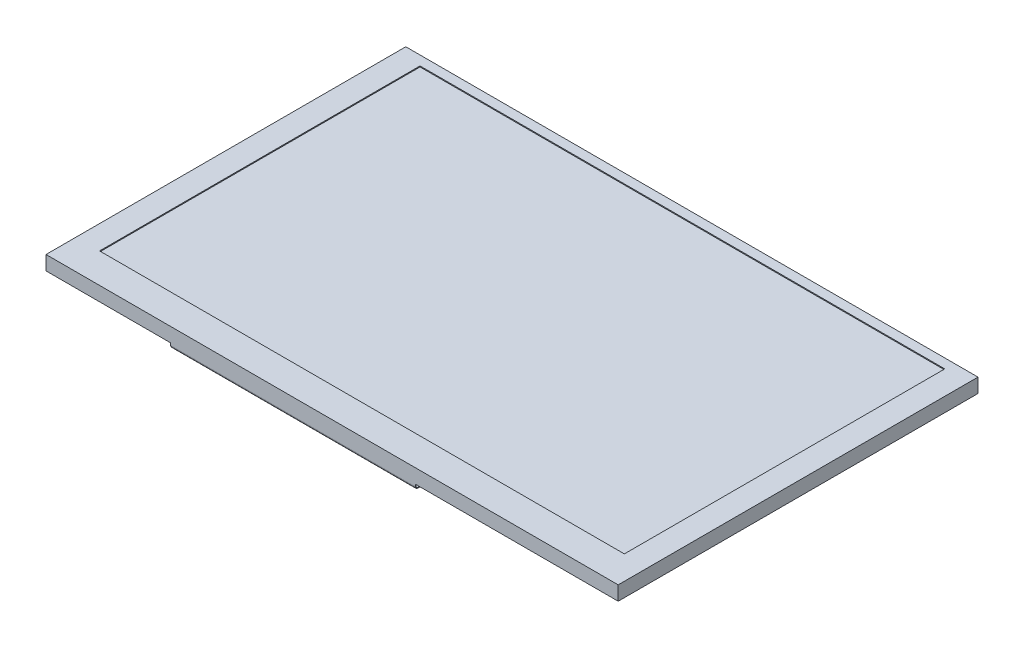
ISO-10303-21;
HEADER;
FILE_DESCRIPTION(('STEP AP214'),'2;1');
FILE_NAME('part.step','',(''),(''),'','','');
FILE_SCHEMA(('AUTOMOTIVE_DESIGN { 1 0 10303 214 1 1 1 1 }'));
ENDSEC;
DATA;
#1=APPLICATION_CONTEXT('core data for automotive mechanical design processes');
#2=APPLICATION_PROTOCOL_DEFINITION('international standard','automotive_design',2000,#1);
#3=PRODUCT_CONTEXT('',#1,'mechanical');
#4=PRODUCT('Part','Part','',(#3));
#5=PRODUCT_RELATED_PRODUCT_CATEGORY('part','',(#4));
#6=PRODUCT_DEFINITION_FORMATION('','',#4);
#7=PRODUCT_DEFINITION_CONTEXT('part definition',#1,'design');
#8=PRODUCT_DEFINITION('design','',#6,#7);
#9=PRODUCT_DEFINITION_SHAPE('','',#8);
#10=(LENGTH_UNIT() NAMED_UNIT(*) SI_UNIT(.MILLI.,.METRE.));
#11=(NAMED_UNIT(*) PLANE_ANGLE_UNIT() SI_UNIT($,.RADIAN.));
#12=(NAMED_UNIT(*) SI_UNIT($,.STERADIAN.) SOLID_ANGLE_UNIT());
#13=UNCERTAINTY_MEASURE_WITH_UNIT(LENGTH_MEASURE(1.E-05),#10,'distance_accuracy_value','');
#14=(GEOMETRIC_REPRESENTATION_CONTEXT(3) GLOBAL_UNCERTAINTY_ASSIGNED_CONTEXT((#13)) GLOBAL_UNIT_ASSIGNED_CONTEXT((#10,
#11,#12)) REPRESENTATION_CONTEXT('',''));
#15=CARTESIAN_POINT('',(0.,0.,0.));
#16=DIRECTION('',(0.,0.,1.));
#17=DIRECTION('',(1.,0.,0.));
#18=AXIS2_PLACEMENT_3D('',#15,#16,#17);
#19=CARTESIAN_POINT('',(-13.45,13.5,5.16668277460246));
#20=DIRECTION('',(0.,-1.,-1.89297366646491E-13));
#21=DIRECTION('',(0.,1.89297366646491E-13,-1.));
#22=AXIS2_PLACEMENT_3D('',#19,#20,#21);
#23=PLANE('',#22);
#24=DIRECTION('',(-1.,0.,0.));
#25=VECTOR('',#24,1.);
#26=CARTESIAN_POINT('',(-34.05,13.5,5.16668277460246));
#27=LINE('',#26,#25);
#28=CARTESIAN_POINT('',(-13.45,13.5,5.16668277460246));
#29=VERTEX_POINT('',#28);
#30=CARTESIAN_POINT('',(-34.05,13.5,5.16668277460246));
#31=VERTEX_POINT('',#30);
#32=EDGE_CURVE('E11',#29,#31,#27,.T.);
#33=ORIENTED_EDGE('',*,*,#32,.T.);
#34=DIRECTION('',(0.,1.89297366647237E-13,-1.));
#35=VECTOR('',#34,1.);
#36=CARTESIAN_POINT('',(-34.05,13.5,5.16668277460246));
#37=LINE('',#36,#35);
#38=CARTESIAN_POINT('',(-34.05,13.5000000000027,-9.05));
#39=VERTEX_POINT('',#38);
#40=EDGE_CURVE('E348',#31,#39,#37,.T.);
#41=ORIENTED_EDGE('',*,*,#40,.T.);
#42=DIRECTION('',(-1.,0.,0.));
#43=VECTOR('',#42,1.);
#44=CARTESIAN_POINT('',(-34.05,13.5000000000027,-9.05));
#45=LINE('',#44,#43);
#46=CARTESIAN_POINT('',(-13.45,13.5000000000027,-9.05));
#47=VERTEX_POINT('',#46);
#48=EDGE_CURVE('E387',#47,#39,#45,.T.);
#49=ORIENTED_EDGE('',*,*,#48,.F.);
#50=DIRECTION('',(0.,1.89297366647237E-13,-1.));
#51=VECTOR('',#50,1.);
#52=CARTESIAN_POINT('',(-13.45,13.5,5.16668277460246));
#53=LINE('',#52,#51);
#54=EDGE_CURVE('E367',#29,#47,#53,.T.);
#55=ORIENTED_EDGE('',*,*,#54,.F.);
#56=EDGE_LOOP('',(#33,#41,#49,#55));
#57=FACE_BOUND('',#56,.T.);
#58=ADVANCED_FACE('F17',(#57),#23,.T.);
#59=CARTESIAN_POINT('',(-34.05,13.65,5.16668277295395));
#60=DIRECTION('',(0.,1.,1.89297366646491E-13));
#61=DIRECTION('',(0.,1.89297366646491E-13,-1.));
#62=AXIS2_PLACEMENT_3D('',#59,#60,#61);
#63=PLANE('',#62);
#64=DIRECTION('',(1.,0.,0.));
#65=VECTOR('',#64,1.);
#66=CARTESIAN_POINT('',(-13.45,13.65,5.16668277295395));
#67=LINE('',#66,#65);
#68=CARTESIAN_POINT('',(-34.05,13.65,5.16668277295395));
#69=VERTEX_POINT('',#68);
#70=CARTESIAN_POINT('',(-13.45,13.65,5.16668277295395));
#71=VERTEX_POINT('',#70);
#72=EDGE_CURVE('E20',#69,#71,#67,.T.);
#73=ORIENTED_EDGE('',*,*,#72,.T.);
#74=DIRECTION('',(0.,1.89297366647237E-13,-1.));
#75=VECTOR('',#74,1.);
#76=CARTESIAN_POINT('',(-13.45,13.65,5.16668277295395));
#77=LINE('',#76,#75);
#78=CARTESIAN_POINT('',(-13.45,13.6500000000027,-9.05000000164849));
#79=VERTEX_POINT('',#78);
#80=EDGE_CURVE('E370',#71,#79,#77,.T.);
#81=ORIENTED_EDGE('',*,*,#80,.T.);
#82=DIRECTION('',(1.,0.,0.));
#83=VECTOR('',#82,1.);
#84=CARTESIAN_POINT('',(-13.45,13.6500000000027,-9.05000000164849));
#85=LINE('',#84,#83);
#86=CARTESIAN_POINT('',(-34.05,13.6500000000027,-9.05000000164849));
#87=VERTEX_POINT('',#86);
#88=EDGE_CURVE('E396',#87,#79,#85,.T.);
#89=ORIENTED_EDGE('',*,*,#88,.F.);
#90=DIRECTION('',(0.,1.89297366647237E-13,-1.));
#91=VECTOR('',#90,1.);
#92=CARTESIAN_POINT('',(-34.05,13.65,5.16668277295395));
#93=LINE('',#92,#91);
#94=EDGE_CURVE('E340',#69,#87,#93,.T.);
#95=ORIENTED_EDGE('',*,*,#94,.F.);
#96=EDGE_LOOP('',(#73,#81,#89,#95));
#97=FACE_BOUND('',#96,.T.);
#98=ADVANCED_FACE('F601',(#97),#63,.T.);
#99=CARTESIAN_POINT('',(-23.75,24.8610000376505,5.16668277460244));
#100=DIRECTION('',(1.,0.,0.));
#101=DIRECTION('',(0.,-0.955990239633878,0.29339846919294));
#102=AXIS2_PLACEMENT_3D('',#99,#100,#101);
#103=CYLINDRICAL_SURFACE('',#102,11.3610000376505);
#104=DIRECTION('',(-1.,0.,0.));
#105=VECTOR('',#104,1.);
#106=CARTESIAN_POINT('',(-34.05,13.9999948891765,8.49998279415004));
#107=LINE('',#106,#105);
#108=CARTESIAN_POINT('',(-13.45,13.9999948891765,8.49998279415004));
#109=VERTEX_POINT('',#108);
#110=CARTESIAN_POINT('',(-34.05,13.9999948891765,8.49998279415004));
#111=VERTEX_POINT('',#110);
#112=EDGE_CURVE('E64',#109,#111,#107,.T.);
#113=ORIENTED_EDGE('',*,*,#112,.T.);
#114=CARTESIAN_POINT('',(-34.05,24.8610000376504,5.16668277460245));
#115=DIRECTION('',(1.,0.,0.));
#116=DIRECTION('',(0.,-0.955990239633877,0.293398469192942));
#117=AXIS2_PLACEMENT_3D('',#114,#115,#116);
#118=CIRCLE('',#117,11.3610000376504);
#119=EDGE_CURVE('E357',#111,#31,#118,.T.);
#120=ORIENTED_EDGE('',*,*,#119,.T.);
#121=ORIENTED_EDGE('',*,*,#32,.F.);
#122=CARTESIAN_POINT('',(-13.45,24.8610000376504,5.16668277460245));
#123=DIRECTION('',(1.,0.,0.));
#124=DIRECTION('',(0.,-0.955990239633877,0.293398469192942));
#125=AXIS2_PLACEMENT_3D('',#122,#123,#124);
#126=CIRCLE('',#125,11.3610000376504);
#127=EDGE_CURVE('E371',#109,#29,#126,.T.);
#128=ORIENTED_EDGE('',*,*,#127,.F.);
#129=EDGE_LOOP('',(#113,#120,#121,#128));
#130=FACE_BOUND('',#129,.T.);
#131=ADVANCED_FACE('F610',(#130),#103,.T.);
#132=CARTESIAN_POINT('',(-23.75,24.8610000376505,5.16668277460244));
#133=DIRECTION('',(1.,0.,0.));
#134=DIRECTION('',(0.,-0.955990239633878,0.29339846919294));
#135=AXIS2_PLACEMENT_3D('',#132,#133,#134);
#136=CYLINDRICAL_SURFACE('',#135,11.2110000376505);
#137=DIRECTION('',(1.,0.,0.));
#138=VECTOR('',#137,1.);
#139=CARTESIAN_POINT('',(-13.45,14.1433934246379,8.45597302219514));
#140=LINE('',#139,#138);
#141=CARTESIAN_POINT('',(-34.05,14.1433934246379,8.45597302219514));
#142=VERTEX_POINT('',#141);
#143=CARTESIAN_POINT('',(-13.45,14.1433934246379,8.45597302219514));
#144=VERTEX_POINT('',#143);
#145=EDGE_CURVE('E40',#142,#144,#140,.T.);
#146=ORIENTED_EDGE('',*,*,#145,.T.);
#147=CARTESIAN_POINT('',(-13.45,24.8610000376504,5.16668277460246));
#148=DIRECTION('',(1.,0.,0.));
#149=DIRECTION('',(0.,-0.95599023967702,0.29339846905237));
#150=AXIS2_PLACEMENT_3D('',#147,#148,#149);
#151=CIRCLE('',#150,11.2110000376504);
#152=EDGE_CURVE('E417',#144,#71,#151,.T.);
#153=ORIENTED_EDGE('',*,*,#152,.T.);
#154=ORIENTED_EDGE('',*,*,#72,.F.);
#155=CARTESIAN_POINT('',(-34.05,24.8610000376504,5.16668277460246));
#156=DIRECTION('',(1.,0.,0.));
#157=DIRECTION('',(0.,-0.95599023967702,0.29339846905237));
#158=AXIS2_PLACEMENT_3D('',#155,#156,#157);
#159=CIRCLE('',#158,11.2110000376504);
#160=EDGE_CURVE('E336',#142,#69,#159,.T.);
#161=ORIENTED_EDGE('',*,*,#160,.F.);
#162=EDGE_LOOP('',(#146,#153,#154,#161));
#163=FACE_BOUND('',#162,.T.);
#164=ADVANCED_FACE('F597',(#163),#136,.F.);
#165=CARTESIAN_POINT('',(-23.75,3.13876703129668,11.8333511643941));
#166=DIRECTION('',(-1.,0.,0.));
#167=DIRECTION('',(0.,1.,1.09900589232554E-08));
#168=AXIS2_PLACEMENT_3D('',#165,#166,#167);
#169=CYLINDRICAL_SURFACE('',#168,11.3612329996585);
#170=DIRECTION('',(-1.,0.,0.));
#171=VECTOR('',#170,1.);
#172=CARTESIAN_POINT('',(-34.05,14.5000000309551,11.8333512892548));
#173=LINE('',#172,#171);
#174=CARTESIAN_POINT('',(-13.45,14.5000000309551,11.8333512892548));
#175=VERTEX_POINT('',#174);
#176=CARTESIAN_POINT('',(-34.05,14.5000000309551,11.8333512892548));
#177=VERTEX_POINT('',#176);
#178=EDGE_CURVE('E74',#175,#177,#173,.T.);
#179=ORIENTED_EDGE('',*,*,#178,.T.);
#180=CARTESIAN_POINT('',(-34.0499999999988,3.13876703129671,11.8333511643941));
#181=DIRECTION('',(-1.,-1.04438564009059E-13,0.));
#182=DIRECTION('',(-1.04438563807627E-13,1.,1.09900621297027E-08));
#183=AXIS2_PLACEMENT_3D('',#180,#181,#182);
#184=CIRCLE('',#183,11.3612329996584);
#185=EDGE_CURVE('E360',#177,#111,#184,.T.);
#186=ORIENTED_EDGE('',*,*,#185,.T.);
#187=ORIENTED_EDGE('',*,*,#112,.F.);
#188=CARTESIAN_POINT('',(-13.4499999999997,3.13876703129671,11.8333511643941));
#189=DIRECTION('',(-1.,0.,0.));
#190=DIRECTION('',(0.,1.,1.09900621297027E-08));
#191=AXIS2_PLACEMENT_3D('',#188,#189,#190);
#192=CIRCLE('',#191,11.3612329996584);
#193=EDGE_CURVE('E413',#175,#109,#192,.T.);
#194=ORIENTED_EDGE('',*,*,#193,.F.);
#195=EDGE_LOOP('',(#179,#186,#187,#194));
#196=FACE_BOUND('',#195,.T.);
#197=ADVANCED_FACE('F614',(#196),#169,.F.);
#198=CARTESIAN_POINT('',(-23.75,3.13876703129668,11.8333511643941));
#199=DIRECTION('',(-1.,0.,0.));
#200=DIRECTION('',(0.,1.,1.09900588260228E-08));
#201=AXIS2_PLACEMENT_3D('',#198,#199,#200);
#202=CYLINDRICAL_SURFACE('',#201,11.5112329996585);
#203=DIRECTION('',(1.,0.,0.));
#204=VECTOR('',#203,1.);
#205=CARTESIAN_POINT('',(-13.45,14.6500000309551,11.8333512892548));
#206=LINE('',#205,#204);
#207=CARTESIAN_POINT('',(-34.05,14.6500000309551,11.8333512892548));
#208=VERTEX_POINT('',#207);
#209=CARTESIAN_POINT('',(-13.45,14.6500000309551,11.8333512892548));
#210=VERTEX_POINT('',#209);
#211=EDGE_CURVE('E386',#208,#210,#206,.T.);
#212=ORIENTED_EDGE('',*,*,#211,.T.);
#213=CARTESIAN_POINT('',(-13.4499999999997,3.1387670312967,11.8333511643941));
#214=DIRECTION('',(-1.,0.,0.));
#215=DIRECTION('',(0.,1.,1.08468512672666E-08));
#216=AXIS2_PLACEMENT_3D('',#213,#214,#215);
#217=CIRCLE('',#216,11.5112329996584);
#218=EDGE_CURVE('E414',#210,#144,#217,.T.);
#219=ORIENTED_EDGE('',*,*,#218,.T.);
#220=ORIENTED_EDGE('',*,*,#145,.F.);
#221=CARTESIAN_POINT('',(-34.0499999999988,3.1387670312967,11.8333511643941));
#222=DIRECTION('',(-1.,-1.03077651183157E-13,0.));
#223=DIRECTION('',(-1.0307765098694E-13,1.,1.08468512672666E-08));
#224=AXIS2_PLACEMENT_3D('',#221,#222,#223);
#225=CIRCLE('',#224,11.5112329996584);
#226=EDGE_CURVE('E332',#208,#142,#225,.T.);
#227=ORIENTED_EDGE('',*,*,#226,.F.);
#228=EDGE_LOOP('',(#212,#219,#220,#227));
#229=FACE_BOUND('',#228,.T.);
#230=ADVANCED_FACE('F595',(#229),#202,.T.);
#231=CARTESIAN_POINT('',(-13.45,14.5,14.65));
#232=DIRECTION('',(0.,-1.,-1.0990058466838E-08));
#233=DIRECTION('',(0.,1.0990058466838E-08,-1.));
#234=AXIS2_PLACEMENT_3D('',#231,#232,#233);
#235=PLANE('',#234);
#236=DIRECTION('',(-1.,0.,0.));
#237=VECTOR('',#236,1.);
#238=CARTESIAN_POINT('',(17.55,14.5,14.65));
#239=LINE('',#238,#237);
#240=CARTESIAN_POINT('',(-13.45,14.5,14.65));
#241=VERTEX_POINT('',#240);
#242=CARTESIAN_POINT('',(-34.05,14.5,14.65));
#243=VERTEX_POINT('',#242);
#244=EDGE_CURVE('E301',#241,#243,#239,.T.);
#245=ORIENTED_EDGE('',*,*,#244,.T.);
#246=DIRECTION('',(0.,1.0990058466838E-08,-1.));
#247=VECTOR('',#246,1.);
#248=CARTESIAN_POINT('',(-34.05,14.5,14.65));
#249=LINE('',#248,#247);
#250=EDGE_CURVE('E363',#243,#177,#249,.T.);
#251=ORIENTED_EDGE('',*,*,#250,.T.);
#252=ORIENTED_EDGE('',*,*,#178,.F.);
#253=DIRECTION('',(0.,1.0990058466838E-08,-1.));
#254=VECTOR('',#253,1.);
#255=CARTESIAN_POINT('',(-13.45,14.5,14.65));
#256=LINE('',#255,#254);
#257=EDGE_CURVE('E409',#241,#175,#256,.T.);
#258=ORIENTED_EDGE('',*,*,#257,.F.);
#259=EDGE_LOOP('',(#245,#251,#252,#258));
#260=FACE_BOUND('',#259,.T.);
#261=ADVANCED_FACE('F615',(#260),#235,.T.);
#262=CARTESIAN_POINT('',(-13.45,14.65,14.65));
#263=DIRECTION('',(1.,0.,0.));
#264=DIRECTION('',(0.,1.,0.));
#265=AXIS2_PLACEMENT_3D('',#262,#263,#264);
#266=PLANE('',#265);
#267=DIRECTION('',(0.,1.,0.));
#268=VECTOR('',#267,1.);
#269=CARTESIAN_POINT('',(-13.45,14.6125,14.65));
#270=LINE('',#269,#268);
#271=CARTESIAN_POINT('',(-13.45,14.65,14.65));
#272=VERTEX_POINT('',#271);
#273=EDGE_CURVE('E300',#241,#272,#270,.T.);
#274=ORIENTED_EDGE('',*,*,#273,.F.);
#275=ORIENTED_EDGE('',*,*,#257,.T.);
#276=ORIENTED_EDGE('',*,*,#193,.T.);
#277=ORIENTED_EDGE('',*,*,#127,.T.);
#278=ORIENTED_EDGE('',*,*,#54,.T.);
#279=DIRECTION('',(0.,-1.,1.0990058307847E-08));
#280=VECTOR('',#279,1.);
#281=CARTESIAN_POINT('',(-13.45,13.5000000000027,-9.05));
#282=LINE('',#281,#280);
#283=EDGE_CURVE('E400',#79,#47,#282,.T.);
#284=ORIENTED_EDGE('',*,*,#283,.F.);
#285=ORIENTED_EDGE('',*,*,#80,.F.);
#286=ORIENTED_EDGE('',*,*,#152,.F.);
#287=ORIENTED_EDGE('',*,*,#218,.F.);
#288=DIRECTION('',(0.,1.0990058466838E-08,-1.));
#289=VECTOR('',#288,1.);
#290=CARTESIAN_POINT('',(-13.45,14.65,14.65));
#291=LINE('',#290,#289);
#292=EDGE_CURVE('E382',#272,#210,#291,.T.);
#293=ORIENTED_EDGE('',*,*,#292,.F.);
#294=EDGE_LOOP('',(#274,#275,#276,#277,#278,#284,#285,#286,#287,#293));
#295=FACE_BOUND('',#294,.T.);
#296=ADVANCED_FACE('F909',(#295),#266,.T.);
#297=CARTESIAN_POINT('',(-34.05,14.65,14.65));
#298=DIRECTION('',(0.,1.,1.0990058466838E-08));
#299=DIRECTION('',(1.,0.,0.));
#300=AXIS2_PLACEMENT_3D('',#297,#298,#299);
#301=PLANE('',#300);
#302=DIRECTION('',(1.,0.,0.));
#303=VECTOR('',#302,1.);
#304=CARTESIAN_POINT('',(-34.05,14.65,14.65));
#305=LINE('',#304,#303);
#306=CARTESIAN_POINT('',(-34.05,14.65,14.65));
#307=VERTEX_POINT('',#306);
#308=EDGE_CURVE('E381',#307,#272,#305,.T.);
#309=ORIENTED_EDGE('',*,*,#308,.T.);
#310=ORIENTED_EDGE('',*,*,#292,.T.);
#311=ORIENTED_EDGE('',*,*,#211,.F.);
#312=DIRECTION('',(0.,1.0990058466838E-08,-1.));
#313=VECTOR('',#312,1.);
#314=CARTESIAN_POINT('',(-34.05,14.65,14.65));
#315=LINE('',#314,#313);
#316=EDGE_CURVE('E327',#307,#208,#315,.T.);
#317=ORIENTED_EDGE('',*,*,#316,.F.);
#318=EDGE_LOOP('',(#309,#310,#311,#317));
#319=FACE_BOUND('',#318,.T.);
#320=ADVANCED_FACE('F592',(#319),#301,.T.);
#321=CARTESIAN_POINT('',(-23.75,13.5750000000027,-9.05000000082423));
#322=DIRECTION('',(0.,-1.09900584245905E-08,-1.));
#323=DIRECTION('',(0.,-1.,1.09900584245905E-08));
#324=AXIS2_PLACEMENT_3D('',#321,#322,#323);
#325=PLANE('',#324);
#326=ORIENTED_EDGE('',*,*,#88,.T.);
#327=ORIENTED_EDGE('',*,*,#283,.T.);
#328=ORIENTED_EDGE('',*,*,#48,.T.);
#329=DIRECTION('',(0.,1.,-1.0990058307847E-08));
#330=VECTOR('',#329,1.);
#331=CARTESIAN_POINT('',(-34.05,13.6500000000027,-9.05000000164849));
#332=LINE('',#331,#330);
#333=EDGE_CURVE('E344',#39,#87,#332,.T.);
#334=ORIENTED_EDGE('',*,*,#333,.T.);
#335=EDGE_LOOP('',(#326,#327,#328,#334));
#336=FACE_BOUND('',#335,.T.);
#337=ADVANCED_FACE('F606',(#336),#325,.T.);
#338=CARTESIAN_POINT('',(-8.25,14.575,14.65));
#339=DIRECTION('',(0.,0.,1.));
#340=DIRECTION('',(0.,-1.,0.));
#341=AXIS2_PLACEMENT_3D('',#338,#339,#340);
#342=PLANE('',#341);
#343=ORIENTED_EDGE('',*,*,#273,.T.);
#344=DIRECTION('',(1.,0.,0.));
#345=VECTOR('',#344,1.);
#346=CARTESIAN_POINT('',(-34.05,14.65,14.65));
#347=LINE('',#346,#345);
#348=CARTESIAN_POINT('',(17.55,14.65,14.65));
#349=VERTEX_POINT('',#348);
#350=EDGE_CURVE('E352',#272,#349,#347,.T.);
#351=ORIENTED_EDGE('',*,*,#350,.T.);
#352=DIRECTION('',(0.,-1.,0.));
#353=VECTOR('',#352,1.);
#354=CARTESIAN_POINT('',(17.55,14.65,14.65));
#355=LINE('',#354,#353);
#356=CARTESIAN_POINT('',(17.55,14.5,14.65));
#357=VERTEX_POINT('',#356);
#358=EDGE_CURVE('E309',#349,#357,#355,.T.);
#359=ORIENTED_EDGE('',*,*,#358,.T.);
#360=DIRECTION('',(-1.,0.,0.));
#361=VECTOR('',#360,1.);
#362=CARTESIAN_POINT('',(17.55,14.5,14.65));
#363=LINE('',#362,#361);
#364=EDGE_CURVE('E296',#357,#241,#363,.T.);
#365=ORIENTED_EDGE('',*,*,#364,.T.);
#366=EDGE_LOOP('',(#343,#351,#359,#365));
#367=FACE_BOUND('',#366,.T.);
#368=ADVANCED_FACE('F587',(#367),#342,.F.);
#369=CARTESIAN_POINT('',(17.55,14.5,37.45));
#370=DIRECTION('',(0.,-1.,0.));
#371=DIRECTION('',(0.,0.,-1.));
#372=AXIS2_PLACEMENT_3D('',#369,#370,#371);
#373=PLANE('',#372);
#374=DIRECTION('',(-1.,0.,0.));
#375=VECTOR('',#374,1.);
#376=CARTESIAN_POINT('',(17.55,14.5,37.45));
#377=LINE('',#376,#375);
#378=CARTESIAN_POINT('',(17.55,14.5,37.45));
#379=VERTEX_POINT('',#378);
#380=CARTESIAN_POINT('',(-34.05,14.5,37.45));
#381=VERTEX_POINT('',#380);
#382=EDGE_CURVE('E349',#379,#381,#377,.T.);
#383=ORIENTED_EDGE('',*,*,#382,.T.);
#384=DIRECTION('',(0.,0.,-1.));
#385=VECTOR('',#384,1.);
#386=CARTESIAN_POINT('',(-34.05,14.5,37.45));
#387=LINE('',#386,#385);
#388=EDGE_CURVE('E366',#381,#243,#387,.T.);
#389=ORIENTED_EDGE('',*,*,#388,.T.);
#390=ORIENTED_EDGE('',*,*,#244,.F.);
#391=ORIENTED_EDGE('',*,*,#364,.F.);
#392=DIRECTION('',(0.,0.,-1.));
#393=VECTOR('',#392,1.);
#394=CARTESIAN_POINT('',(17.55,14.5,37.45));
#395=LINE('',#394,#393);
#396=EDGE_CURVE('E305',#379,#357,#395,.T.);
#397=ORIENTED_EDGE('',*,*,#396,.F.);
#398=EDGE_LOOP('',(#383,#389,#390,#391,#397));
#399=FACE_BOUND('',#398,.T.);
#400=ADVANCED_FACE('F617',(#399),#373,.T.);
#401=CARTESIAN_POINT('',(-34.05,14.65,37.45));
#402=DIRECTION('',(0.,1.,0.));
#403=DIRECTION('',(1.,0.,0.));
#404=AXIS2_PLACEMENT_3D('',#401,#402,#403);
#405=PLANE('',#404);
#406=DIRECTION('',(1.,0.,0.));
#407=VECTOR('',#406,1.);
#408=CARTESIAN_POINT('',(-34.05,14.65,37.45));
#409=LINE('',#408,#407);
#410=CARTESIAN_POINT('',(-34.05,14.65,37.45));
#411=VERTEX_POINT('',#410);
#412=CARTESIAN_POINT('',(17.55,14.65,37.45));
#413=VERTEX_POINT('',#412);
#414=EDGE_CURVE('E353',#411,#413,#409,.T.);
#415=ORIENTED_EDGE('',*,*,#414,.T.);
#416=DIRECTION('',(0.,0.,-1.));
#417=VECTOR('',#416,1.);
#418=CARTESIAN_POINT('',(17.55,14.65,37.45));
#419=LINE('',#418,#417);
#420=EDGE_CURVE('E313',#413,#349,#419,.T.);
#421=ORIENTED_EDGE('',*,*,#420,.T.);
#422=ORIENTED_EDGE('',*,*,#350,.F.);
#423=ORIENTED_EDGE('',*,*,#308,.F.);
#424=DIRECTION('',(0.,0.,-1.));
#425=VECTOR('',#424,1.);
#426=CARTESIAN_POINT('',(-34.05,14.65,37.45));
#427=LINE('',#426,#425);
#428=EDGE_CURVE('E324',#411,#307,#427,.T.);
#429=ORIENTED_EDGE('',*,*,#428,.F.);
#430=EDGE_LOOP('',(#415,#421,#422,#423,#429));
#431=FACE_BOUND('',#430,.T.);
#432=ADVANCED_FACE('F577',(#431),#405,.T.);
#433=CARTESIAN_POINT('',(-8.25,15.,37.45));
#434=DIRECTION('',(1.,0.,0.));
#435=DIRECTION('',(0.,0.,1.));
#436=AXIS2_PLACEMENT_3D('',#433,#434,#435);
#437=CYLINDRICAL_SURFACE('',#436,0.5);
#438=DIRECTION('',(-1.,0.,0.));
#439=VECTOR('',#438,1.);
#440=CARTESIAN_POINT('',(17.55,15.,37.95));
#441=LINE('',#440,#439);
#442=CARTESIAN_POINT('',(17.55,15.,37.95));
#443=VERTEX_POINT('',#442);
#444=CARTESIAN_POINT('',(-34.05,15.,37.95));
#445=VERTEX_POINT('',#444);
#446=EDGE_CURVE('E462',#443,#445,#441,.T.);
#447=ORIENTED_EDGE('',*,*,#446,.T.);
#448=CARTESIAN_POINT('',(-34.05,15.,37.45));
#449=DIRECTION('',(1.,0.,0.));
#450=DIRECTION('',(0.,0.,1.));
#451=AXIS2_PLACEMENT_3D('',#448,#449,#450);
#452=CIRCLE('',#451,0.5);
#453=EDGE_CURVE('E375',#445,#381,#452,.T.);
#454=ORIENTED_EDGE('',*,*,#453,.T.);
#455=ORIENTED_EDGE('',*,*,#382,.F.);
#456=CARTESIAN_POINT('',(17.55,15.,37.45));
#457=DIRECTION('',(1.,0.,0.));
#458=DIRECTION('',(0.,0.,1.));
#459=AXIS2_PLACEMENT_3D('',#456,#457,#458);
#460=CIRCLE('',#459,0.5);
#461=EDGE_CURVE('E267',#443,#379,#460,.T.);
#462=ORIENTED_EDGE('',*,*,#461,.F.);
#463=EDGE_LOOP('',(#447,#454,#455,#462));
#464=FACE_BOUND('',#463,.T.);
#465=ADVANCED_FACE('F620',(#464),#437,.T.);
#466=CARTESIAN_POINT('',(-8.25,15.,37.45));
#467=DIRECTION('',(1.,0.,0.));
#468=DIRECTION('',(0.,0.,1.));
#469=AXIS2_PLACEMENT_3D('',#466,#467,#468);
#470=CYLINDRICAL_SURFACE('',#469,0.35);
#471=DIRECTION('',(1.,0.,0.));
#472=VECTOR('',#471,1.);
#473=CARTESIAN_POINT('',(-34.05,15.,37.8));
#474=LINE('',#473,#472);
#475=CARTESIAN_POINT('',(-34.05,15.,37.8));
#476=VERTEX_POINT('',#475);
#477=CARTESIAN_POINT('',(17.55,15.,37.8));
#478=VERTEX_POINT('',#477);
#479=EDGE_CURVE('E263',#476,#478,#474,.T.);
#480=ORIENTED_EDGE('',*,*,#479,.T.);
#481=CARTESIAN_POINT('',(17.55,15.,37.45));
#482=DIRECTION('',(1.,0.,0.));
#483=DIRECTION('',(0.,0.,1.));
#484=AXIS2_PLACEMENT_3D('',#481,#482,#483);
#485=CIRCLE('',#484,0.35);
#486=EDGE_CURVE('E317',#478,#413,#485,.T.);
#487=ORIENTED_EDGE('',*,*,#486,.T.);
#488=ORIENTED_EDGE('',*,*,#414,.F.);
#489=CARTESIAN_POINT('',(-34.05,15.,37.45));
#490=DIRECTION('',(1.,0.,0.));
#491=DIRECTION('',(0.,0.,1.));
#492=AXIS2_PLACEMENT_3D('',#489,#490,#491);
#493=CIRCLE('',#492,0.35);
#494=EDGE_CURVE('E321',#476,#411,#493,.T.);
#495=ORIENTED_EDGE('',*,*,#494,.F.);
#496=EDGE_LOOP('',(#480,#487,#488,#495));
#497=FACE_BOUND('',#496,.T.);
#498=ADVANCED_FACE('F582',(#497),#470,.F.);
#499=CARTESIAN_POINT('',(-34.05,15.5,37.95));
#500=DIRECTION('',(-1.,0.,0.));
#501=DIRECTION('',(0.,0.,1.));
#502=AXIS2_PLACEMENT_3D('',#499,#500,#501);
#503=PLANE('',#502);
#504=DIRECTION('',(0.,0.,1.));
#505=VECTOR('',#504,1.);
#506=CARTESIAN_POINT('',(-34.05,15.5,18.975));
#507=LINE('',#506,#505);
#508=CARTESIAN_POINT('',(-34.05,15.5,37.8));
#509=VERTEX_POINT('',#508);
#510=CARTESIAN_POINT('',(-34.05,15.5,37.95));
#511=VERTEX_POINT('',#510);
#512=EDGE_CURVE('E270',#509,#511,#507,.T.);
#513=ORIENTED_EDGE('',*,*,#512,.F.);
#514=DIRECTION('',(0.,-1.,0.));
#515=VECTOR('',#514,1.);
#516=CARTESIAN_POINT('',(-34.05,15.5,37.8));
#517=LINE('',#516,#515);
#518=EDGE_CURVE('E255',#509,#476,#517,.T.);
#519=ORIENTED_EDGE('',*,*,#518,.T.);
#520=ORIENTED_EDGE('',*,*,#494,.T.);
#521=ORIENTED_EDGE('',*,*,#428,.T.);
#522=ORIENTED_EDGE('',*,*,#316,.T.);
#523=ORIENTED_EDGE('',*,*,#226,.T.);
#524=ORIENTED_EDGE('',*,*,#160,.T.);
#525=ORIENTED_EDGE('',*,*,#94,.T.);
#526=ORIENTED_EDGE('',*,*,#333,.F.);
#527=ORIENTED_EDGE('',*,*,#40,.F.);
#528=ORIENTED_EDGE('',*,*,#119,.F.);
#529=ORIENTED_EDGE('',*,*,#185,.F.);
#530=ORIENTED_EDGE('',*,*,#250,.F.);
#531=ORIENTED_EDGE('',*,*,#388,.F.);
#532=ORIENTED_EDGE('',*,*,#453,.F.);
#533=DIRECTION('',(0.,-1.,0.));
#534=VECTOR('',#533,1.);
#535=CARTESIAN_POINT('',(-34.05,15.5,37.95));
#536=LINE('',#535,#534);
#537=EDGE_CURVE('E273',#511,#445,#536,.T.);
#538=ORIENTED_EDGE('',*,*,#537,.F.);
#539=EDGE_LOOP('',(#513,#519,#520,#521,#522,#523,#524,#525,#526,#527,#528,#529,#530,#531,#532,#538));
#540=FACE_BOUND('',#539,.T.);
#541=ADVANCED_FACE('F271',(#540),#503,.T.);
#542=CARTESIAN_POINT('',(17.55,15.5,37.8));
#543=DIRECTION('',(1.,0.,0.));
#544=DIRECTION('',(0.,1.,0.));
#545=AXIS2_PLACEMENT_3D('',#542,#543,#544);
#546=PLANE('',#545);
#547=DIRECTION('',(0.,0.,-1.));
#548=VECTOR('',#547,1.);
#549=CARTESIAN_POINT('',(17.55,15.5,18.9));
#550=LINE('',#549,#548);
#551=CARTESIAN_POINT('',(17.55,15.5,37.95));
#552=VERTEX_POINT('',#551);
#553=CARTESIAN_POINT('',(17.55,15.5,37.8));
#554=VERTEX_POINT('',#553);
#555=EDGE_CURVE('E281',#552,#554,#550,.T.);
#556=ORIENTED_EDGE('',*,*,#555,.F.);
#557=DIRECTION('',(0.,-1.,0.));
#558=VECTOR('',#557,1.);
#559=CARTESIAN_POINT('',(17.55,15.5,37.95));
#560=LINE('',#559,#558);
#561=EDGE_CURVE('E466',#552,#443,#560,.T.);
#562=ORIENTED_EDGE('',*,*,#561,.T.);
#563=ORIENTED_EDGE('',*,*,#461,.T.);
#564=ORIENTED_EDGE('',*,*,#396,.T.);
#565=ORIENTED_EDGE('',*,*,#358,.F.);
#566=ORIENTED_EDGE('',*,*,#420,.F.);
#567=ORIENTED_EDGE('',*,*,#486,.F.);
#568=DIRECTION('',(0.,-1.,0.));
#569=VECTOR('',#568,1.);
#570=CARTESIAN_POINT('',(17.55,15.5,37.8));
#571=LINE('',#570,#569);
#572=EDGE_CURVE('E277',#554,#478,#571,.T.);
#573=ORIENTED_EDGE('',*,*,#572,.F.);
#574=EDGE_LOOP('',(#556,#562,#563,#564,#565,#566,#567,#573));
#575=FACE_BOUND('',#574,.T.);
#576=ADVANCED_FACE('F584',(#575),#546,.T.);
#577=CARTESIAN_POINT('',(-34.05,15.5,37.8));
#578=DIRECTION('',(0.,0.,-1.));
#579=DIRECTION('',(-1.,0.,0.));
#580=AXIS2_PLACEMENT_3D('',#577,#578,#579);
#581=PLANE('',#580);
#582=DIRECTION('',(-1.,0.,0.));
#583=VECTOR('',#582,1.);
#584=CARTESIAN_POINT('',(-17.025,15.5,37.8));
#585=LINE('',#584,#583);
#586=EDGE_CURVE('E260',#554,#509,#585,.T.);
#587=ORIENTED_EDGE('',*,*,#586,.F.);
#588=ORIENTED_EDGE('',*,*,#572,.T.);
#589=ORIENTED_EDGE('',*,*,#479,.F.);
#590=ORIENTED_EDGE('',*,*,#518,.F.);
#591=EDGE_LOOP('',(#587,#588,#589,#590));
#592=FACE_BOUND('',#591,.T.);
#593=ADVANCED_FACE('F257',(#592),#581,.T.);
#594=CARTESIAN_POINT('',(0.,15.5,0.));
#595=DIRECTION('',(0.,1.,0.));
#596=DIRECTION('',(1.,0.,0.));
#597=AXIS2_PLACEMENT_3D('',#594,#595,#596);
#598=PLANE('',#597);
#599=ORIENTED_EDGE('',*,*,#555,.T.);
#600=ORIENTED_EDGE('',*,*,#586,.T.);
#601=ORIENTED_EDGE('',*,*,#512,.T.);
#602=DIRECTION('',(1.,0.,0.));
#603=VECTOR('',#602,1.);
#604=CARTESIAN_POINT('',(-60.35,15.5,37.95));
#605=LINE('',#604,#603);
#606=CARTESIAN_POINT('',(-60.35,15.5,37.95));
#607=VERTEX_POINT('',#606);
#608=EDGE_CURVE('E444',#607,#511,#605,.T.);
#609=ORIENTED_EDGE('',*,*,#608,.F.);
#610=DIRECTION('',(0.,0.,1.));
#611=VECTOR('',#610,1.);
#612=CARTESIAN_POINT('',(-60.35,15.5,-37.95));
#613=LINE('',#612,#611);
#614=CARTESIAN_POINT('',(-60.35,15.5,-37.95));
#615=VERTEX_POINT('',#614);
#616=EDGE_CURVE('E457',#615,#607,#613,.T.);
#617=ORIENTED_EDGE('',*,*,#616,.F.);
#618=DIRECTION('',(-1.,0.,0.));
#619=VECTOR('',#618,1.);
#620=CARTESIAN_POINT('',(60.35,15.5,-37.95));
#621=LINE('',#620,#619);
#622=CARTESIAN_POINT('',(60.35,15.5,-37.95));
#623=VERTEX_POINT('',#622);
#624=EDGE_CURVE('E453',#623,#615,#621,.T.);
#625=ORIENTED_EDGE('',*,*,#624,.F.);
#626=DIRECTION('',(0.,0.,-1.));
#627=VECTOR('',#626,1.);
#628=CARTESIAN_POINT('',(60.35,15.5,37.95));
#629=LINE('',#628,#627);
#630=CARTESIAN_POINT('',(60.35,15.5,37.95));
#631=VERTEX_POINT('',#630);
#632=EDGE_CURVE('E439',#631,#623,#629,.T.);
#633=ORIENTED_EDGE('',*,*,#632,.F.);
#634=DIRECTION('',(1.,0.,0.));
#635=VECTOR('',#634,1.);
#636=CARTESIAN_POINT('',(-60.35,15.5,37.95));
#637=LINE('',#636,#635);
#638=EDGE_CURVE('E470',#552,#631,#637,.T.);
#639=ORIENTED_EDGE('',*,*,#638,.F.);
#640=EDGE_LOOP('',(#599,#600,#601,#609,#617,#625,#633,#639));
#641=FACE_BOUND('',#640,.T.);
#642=ADVANCED_FACE('F279',(#641),#598,.F.);
#643=CARTESIAN_POINT('',(55.35,18.5,-35.95));
#644=DIRECTION('',(1.,0.,0.));
#645=DIRECTION('',(0.,1.,0.));
#646=AXIS2_PLACEMENT_3D('',#643,#644,#645);
#647=PLANE('',#646);
#648=DIRECTION('',(0.,0.,1.));
#649=VECTOR('',#648,1.);
#650=CARTESIAN_POINT('',(55.35,18.5,-17.975));
#651=LINE('',#650,#649);
#652=CARTESIAN_POINT('',(55.35,18.5,-35.95));
#653=VERTEX_POINT('',#652);
#654=CARTESIAN_POINT('',(55.35,18.5,31.65));
#655=VERTEX_POINT('',#654);
#656=EDGE_CURVE('E506',#653,#655,#651,.T.);
#657=ORIENTED_EDGE('',*,*,#656,.F.);
#658=DIRECTION('',(0.,-1.,0.));
#659=VECTOR('',#658,1.);
#660=CARTESIAN_POINT('',(55.35,18.5,-35.95));
#661=LINE('',#660,#659);
#662=CARTESIAN_POINT('',(55.35,18.3,-35.95));
#663=VERTEX_POINT('',#662);
#664=EDGE_CURVE('E288',#653,#663,#661,.T.);
#665=ORIENTED_EDGE('',*,*,#664,.T.);
#666=DIRECTION('',(0.,0.,1.));
#667=VECTOR('',#666,1.);
#668=CARTESIAN_POINT('',(55.35,18.3,-35.95));
#669=LINE('',#668,#667);
#670=CARTESIAN_POINT('',(55.35,18.3,31.65));
#671=VERTEX_POINT('',#670);
#672=EDGE_CURVE('E477',#663,#671,#669,.T.);
#673=ORIENTED_EDGE('',*,*,#672,.T.);
#674=DIRECTION('',(0.,-1.,0.));
#675=VECTOR('',#674,1.);
#676=CARTESIAN_POINT('',(55.35,18.5,31.65));
#677=LINE('',#676,#675);
#678=EDGE_CURVE('E489',#655,#671,#677,.T.);
#679=ORIENTED_EDGE('',*,*,#678,.F.);
#680=EDGE_LOOP('',(#657,#665,#673,#679));
#681=FACE_BOUND('',#680,.T.);
#682=ADVANCED_FACE('F502',(#681),#647,.F.);
#683=CARTESIAN_POINT('',(-55.35,18.5,-35.95));
#684=DIRECTION('',(0.,0.,-1.));
#685=DIRECTION('',(0.,-1.,0.));
#686=AXIS2_PLACEMENT_3D('',#683,#684,#685);
#687=PLANE('',#686);
#688=DIRECTION('',(1.,0.,0.));
#689=VECTOR('',#688,1.);
#690=CARTESIAN_POINT('',(-27.675,18.5,-35.95));
#691=LINE('',#690,#689);
#692=CARTESIAN_POINT('',(-55.35,18.5,-35.95));
#693=VERTEX_POINT('',#692);
#694=EDGE_CURVE('E434',#693,#653,#691,.T.);
#695=ORIENTED_EDGE('',*,*,#694,.F.);
#696=DIRECTION('',(0.,-1.,0.));
#697=VECTOR('',#696,1.);
#698=CARTESIAN_POINT('',(-55.35,18.5,-35.95));
#699=LINE('',#698,#697);
#700=CARTESIAN_POINT('',(-55.35,18.3,-35.95));
#701=VERTEX_POINT('',#700);
#702=EDGE_CURVE('E495',#693,#701,#699,.T.);
#703=ORIENTED_EDGE('',*,*,#702,.T.);
#704=DIRECTION('',(1.,0.,0.));
#705=VECTOR('',#704,1.);
#706=CARTESIAN_POINT('',(-55.35,18.3,-35.95));
#707=LINE('',#706,#705);
#708=EDGE_CURVE('E481',#701,#663,#707,.T.);
#709=ORIENTED_EDGE('',*,*,#708,.T.);
#710=ORIENTED_EDGE('',*,*,#664,.F.);
#711=EDGE_LOOP('',(#695,#703,#709,#710));
#712=FACE_BOUND('',#711,.T.);
#713=ADVANCED_FACE('F511',(#712),#687,.F.);
#714=CARTESIAN_POINT('',(-55.35,18.5,31.65));
#715=DIRECTION('',(-1.,0.,0.));
#716=DIRECTION('',(0.,0.,1.));
#717=AXIS2_PLACEMENT_3D('',#714,#715,#716);
#718=PLANE('',#717);
#719=DIRECTION('',(0.,0.,-1.));
#720=VECTOR('',#719,1.);
#721=CARTESIAN_POINT('',(-55.35,18.5,15.825));
#722=LINE('',#721,#720);
#723=CARTESIAN_POINT('',(-55.35,18.5,31.65));
#724=VERTEX_POINT('',#723);
#725=EDGE_CURVE('E524',#724,#693,#722,.T.);
#726=ORIENTED_EDGE('',*,*,#725,.F.);
#727=DIRECTION('',(0.,-1.,0.));
#728=VECTOR('',#727,1.);
#729=CARTESIAN_POINT('',(-55.35,18.5,31.65));
#730=LINE('',#729,#728);
#731=CARTESIAN_POINT('',(-55.35,18.3,31.65));
#732=VERTEX_POINT('',#731);
#733=EDGE_CURVE('E492',#724,#732,#730,.T.);
#734=ORIENTED_EDGE('',*,*,#733,.T.);
#735=DIRECTION('',(0.,0.,-1.));
#736=VECTOR('',#735,1.);
#737=CARTESIAN_POINT('',(-55.35,18.3,31.65));
#738=LINE('',#737,#736);
#739=EDGE_CURVE('E485',#732,#701,#738,.T.);
#740=ORIENTED_EDGE('',*,*,#739,.T.);
#741=ORIENTED_EDGE('',*,*,#702,.F.);
#742=EDGE_LOOP('',(#726,#734,#740,#741));
#743=FACE_BOUND('',#742,.T.);
#744=ADVANCED_FACE('F854',(#743),#718,.F.);
#745=CARTESIAN_POINT('',(55.35,18.5,31.65));
#746=DIRECTION('',(0.,0.,1.));
#747=DIRECTION('',(1.,0.,0.));
#748=AXIS2_PLACEMENT_3D('',#745,#746,#747);
#749=PLANE('',#748);
#750=DIRECTION('',(-1.,0.,0.));
#751=VECTOR('',#750,1.);
#752=CARTESIAN_POINT('',(27.675,18.5,31.65));
#753=LINE('',#752,#751);
#754=EDGE_CURVE('E520',#655,#724,#753,.T.);
#755=ORIENTED_EDGE('',*,*,#754,.F.);
#756=ORIENTED_EDGE('',*,*,#678,.T.);
#757=DIRECTION('',(-1.,0.,0.));
#758=VECTOR('',#757,1.);
#759=CARTESIAN_POINT('',(55.35,18.3,31.65));
#760=LINE('',#759,#758);
#761=EDGE_CURVE('E473',#671,#732,#760,.T.);
#762=ORIENTED_EDGE('',*,*,#761,.T.);
#763=ORIENTED_EDGE('',*,*,#733,.F.);
#764=EDGE_LOOP('',(#755,#756,#762,#763));
#765=FACE_BOUND('',#764,.T.);
#766=ADVANCED_FACE('F517',(#765),#749,.F.);
#767=CARTESIAN_POINT('',(0.,18.3,-2.15));
#768=DIRECTION('',(0.,-1.,0.));
#769=DIRECTION('',(0.,0.,-1.));
#770=AXIS2_PLACEMENT_3D('',#767,#768,#769);
#771=PLANE('',#770);
#772=ORIENTED_EDGE('',*,*,#761,.F.);
#773=ORIENTED_EDGE('',*,*,#672,.F.);
#774=ORIENTED_EDGE('',*,*,#708,.F.);
#775=ORIENTED_EDGE('',*,*,#739,.F.);
#776=EDGE_LOOP('',(#772,#773,#774,#775));
#777=FACE_BOUND('',#776,.T.);
#778=ADVANCED_FACE('F514',(#777),#771,.F.);
#779=CARTESIAN_POINT('',(-60.35,15.5,37.95));
#780=DIRECTION('',(0.,0.,1.));
#781=DIRECTION('',(1.,0.,0.));
#782=AXIS2_PLACEMENT_3D('',#779,#780,#781);
#783=PLANE('',#782);
#784=ORIENTED_EDGE('',*,*,#608,.T.);
#785=ORIENTED_EDGE('',*,*,#537,.T.);
#786=ORIENTED_EDGE('',*,*,#446,.F.);
#787=ORIENTED_EDGE('',*,*,#561,.F.);
#788=ORIENTED_EDGE('',*,*,#638,.T.);
#789=DIRECTION('',(0.,1.,0.));
#790=VECTOR('',#789,1.);
#791=CARTESIAN_POINT('',(60.35,15.5,37.95));
#792=LINE('',#791,#790);
#793=CARTESIAN_POINT('',(60.35,18.5,37.95));
#794=VERTEX_POINT('',#793);
#795=EDGE_CURVE('E450',#631,#794,#792,.T.);
#796=ORIENTED_EDGE('',*,*,#795,.T.);
#797=DIRECTION('',(1.,0.,0.));
#798=VECTOR('',#797,1.);
#799=CARTESIAN_POINT('',(-60.35,18.5,37.95));
#800=LINE('',#799,#798);
#801=CARTESIAN_POINT('',(-60.35,18.5,37.95));
#802=VERTEX_POINT('',#801);
#803=EDGE_CURVE('E529',#802,#794,#800,.T.);
#804=ORIENTED_EDGE('',*,*,#803,.F.);
#805=DIRECTION('',(0.,1.,0.));
#806=VECTOR('',#805,1.);
#807=CARTESIAN_POINT('',(-60.35,15.5,37.95));
#808=LINE('',#807,#806);
#809=EDGE_CURVE('E447',#607,#802,#808,.T.);
#810=ORIENTED_EDGE('',*,*,#809,.F.);
#811=EDGE_LOOP('',(#784,#785,#786,#787,#788,#796,#804,#810));
#812=FACE_BOUND('',#811,.T.);
#813=ADVANCED_FACE('F556',(#812),#783,.T.);
#814=CARTESIAN_POINT('',(-60.35,15.5,-37.95));
#815=DIRECTION('',(-1.,0.,0.));
#816=DIRECTION('',(0.,0.,1.));
#817=AXIS2_PLACEMENT_3D('',#814,#815,#816);
#818=PLANE('',#817);
#819=ORIENTED_EDGE('',*,*,#616,.T.);
#820=ORIENTED_EDGE('',*,*,#809,.T.);
#821=DIRECTION('',(0.,0.,1.));
#822=VECTOR('',#821,1.);
#823=CARTESIAN_POINT('',(-60.35,18.5,-37.95));
#824=LINE('',#823,#822);
#825=CARTESIAN_POINT('',(-60.35,18.5,-37.95));
#826=VERTEX_POINT('',#825);
#827=EDGE_CURVE('E535',#826,#802,#824,.T.);
#828=ORIENTED_EDGE('',*,*,#827,.F.);
#829=DIRECTION('',(0.,1.,0.));
#830=VECTOR('',#829,1.);
#831=CARTESIAN_POINT('',(-60.35,15.5,-37.95));
#832=LINE('',#831,#830);
#833=EDGE_CURVE('E454',#615,#826,#832,.T.);
#834=ORIENTED_EDGE('',*,*,#833,.F.);
#835=EDGE_LOOP('',(#819,#820,#828,#834));
#836=FACE_BOUND('',#835,.T.);
#837=ADVANCED_FACE('F549',(#836),#818,.T.);
#838=CARTESIAN_POINT('',(60.35,15.5,-37.95));
#839=DIRECTION('',(0.,0.,-1.));
#840=DIRECTION('',(0.,-1.,0.));
#841=AXIS2_PLACEMENT_3D('',#838,#839,#840);
#842=PLANE('',#841);
#843=ORIENTED_EDGE('',*,*,#624,.T.);
#844=ORIENTED_EDGE('',*,*,#833,.T.);
#845=DIRECTION('',(-1.,0.,0.));
#846=VECTOR('',#845,1.);
#847=CARTESIAN_POINT('',(60.35,18.5,-37.95));
#848=LINE('',#847,#846);
#849=CARTESIAN_POINT('',(60.35,18.5,-37.95));
#850=VERTEX_POINT('',#849);
#851=EDGE_CURVE('E563',#850,#826,#848,.T.);
#852=ORIENTED_EDGE('',*,*,#851,.F.);
#853=DIRECTION('',(0.,1.,0.));
#854=VECTOR('',#853,1.);
#855=CARTESIAN_POINT('',(60.35,15.5,-37.95));
#856=LINE('',#855,#854);
#857=EDGE_CURVE('E443',#623,#850,#856,.T.);
#858=ORIENTED_EDGE('',*,*,#857,.F.);
#859=EDGE_LOOP('',(#843,#844,#852,#858));
#860=FACE_BOUND('',#859,.T.);
#861=ADVANCED_FACE('F810',(#860),#842,.T.);
#862=CARTESIAN_POINT('',(60.35,15.5,37.95));
#863=DIRECTION('',(1.,0.,0.));
#864=DIRECTION('',(0.,1.,0.));
#865=AXIS2_PLACEMENT_3D('',#862,#863,#864);
#866=PLANE('',#865);
#867=ORIENTED_EDGE('',*,*,#632,.T.);
#868=ORIENTED_EDGE('',*,*,#857,.T.);
#869=DIRECTION('',(0.,0.,-1.));
#870=VECTOR('',#869,1.);
#871=CARTESIAN_POINT('',(60.35,18.5,37.95));
#872=LINE('',#871,#870);
#873=EDGE_CURVE('E569',#794,#850,#872,.T.);
#874=ORIENTED_EDGE('',*,*,#873,.F.);
#875=ORIENTED_EDGE('',*,*,#795,.F.);
#876=EDGE_LOOP('',(#867,#868,#874,#875));
#877=FACE_BOUND('',#876,.T.);
#878=ADVANCED_FACE('F623',(#877),#866,.T.);
#879=CARTESIAN_POINT('',(0.,18.5,0.));
#880=DIRECTION('',(0.,1.,0.));
#881=DIRECTION('',(1.,0.,0.));
#882=AXIS2_PLACEMENT_3D('',#879,#880,#881);
#883=PLANE('',#882);
#884=ORIENTED_EDGE('',*,*,#656,.T.);
#885=ORIENTED_EDGE('',*,*,#754,.T.);
#886=ORIENTED_EDGE('',*,*,#725,.T.);
#887=ORIENTED_EDGE('',*,*,#694,.T.);
#888=EDGE_LOOP('',(#884,#885,#886,#887));
#889=FACE_BOUND('',#888,.T.);
#890=ORIENTED_EDGE('',*,*,#873,.T.);
#891=ORIENTED_EDGE('',*,*,#851,.T.);
#892=ORIENTED_EDGE('',*,*,#827,.T.);
#893=ORIENTED_EDGE('',*,*,#803,.T.);
#894=EDGE_LOOP('',(#890,#891,#892,#893));
#895=FACE_BOUND('',#894,.T.);
#896=ADVANCED_FACE('F526',(#889,#895),#883,.T.);
#897=CLOSED_SHELL('',(#58,#98,#131,#164,#197,#230,#261,#296,#320,#337,#368,#400,#432,#465,#498,
#541,#576,#593,#642,#682,#713,#744,#766,#778,#813,#837,#861,#878,#896));
#898=MANIFOLD_SOLID_BREP('B1',#897);
#899=ADVANCED_BREP_SHAPE_REPRESENTATION('',(#18,#898),#14);
#900=SHAPE_DEFINITION_REPRESENTATION(#9,#899);
ENDSEC;
END-ISO-10303-21;
